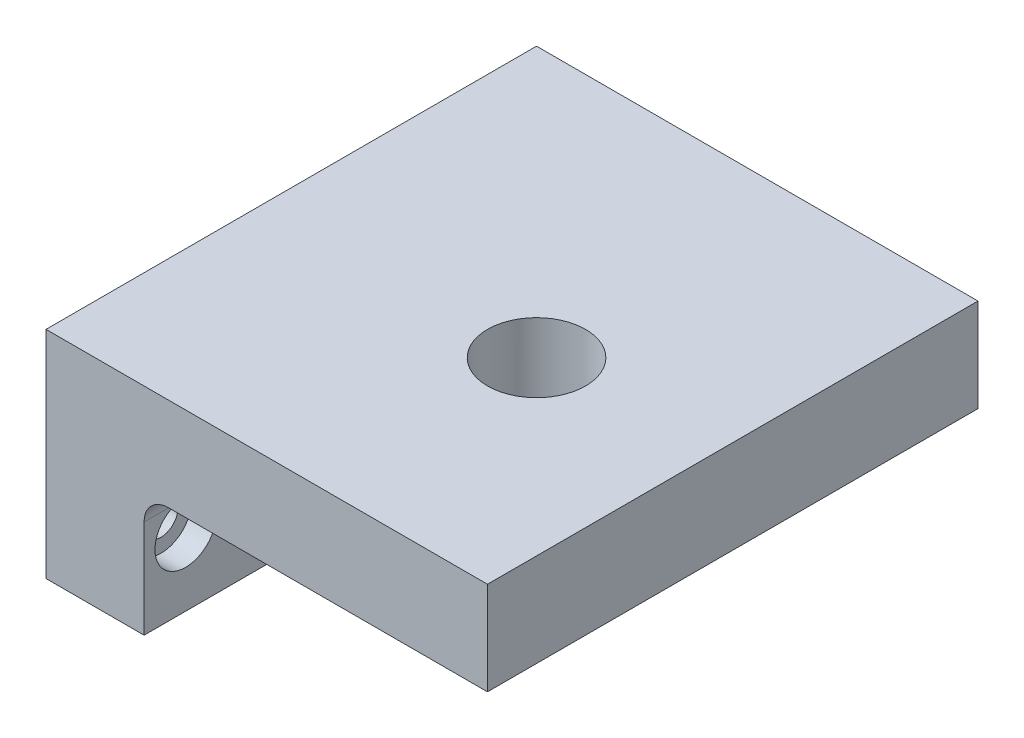
ISO-10303-21;
HEADER;
FILE_DESCRIPTION(('STEP AP214'),'2;1');
FILE_NAME('part.step','',(''),(''),'','','');
FILE_SCHEMA(('AUTOMOTIVE_DESIGN { 1 0 10303 214 1 1 1 1 }'));
ENDSEC;
DATA;
#1=APPLICATION_CONTEXT('core data for automotive mechanical design processes');
#2=APPLICATION_PROTOCOL_DEFINITION('international standard','automotive_design',2000,#1);
#3=PRODUCT_CONTEXT('',#1,'mechanical');
#4=PRODUCT('Part','Part','',(#3));
#5=PRODUCT_RELATED_PRODUCT_CATEGORY('part','',(#4));
#6=PRODUCT_DEFINITION_FORMATION('','',#4);
#7=PRODUCT_DEFINITION_CONTEXT('part definition',#1,'design');
#8=PRODUCT_DEFINITION('design','',#6,#7);
#9=PRODUCT_DEFINITION_SHAPE('','',#8);
#10=(LENGTH_UNIT() NAMED_UNIT(*) SI_UNIT(.MILLI.,.METRE.));
#11=(NAMED_UNIT(*) PLANE_ANGLE_UNIT() SI_UNIT($,.RADIAN.));
#12=(NAMED_UNIT(*) SI_UNIT($,.STERADIAN.) SOLID_ANGLE_UNIT());
#13=UNCERTAINTY_MEASURE_WITH_UNIT(LENGTH_MEASURE(1.E-05),#10,'distance_accuracy_value','');
#14=(GEOMETRIC_REPRESENTATION_CONTEXT(3) GLOBAL_UNCERTAINTY_ASSIGNED_CONTEXT((#13)) GLOBAL_UNIT_ASSIGNED_CONTEXT((#10,
#11,#12)) REPRESENTATION_CONTEXT('',''));
#15=CARTESIAN_POINT('',(0.,0.,0.));
#16=DIRECTION('',(0.,0.,1.));
#17=DIRECTION('',(1.,0.,0.));
#18=AXIS2_PLACEMENT_3D('',#15,#16,#17);
#19=CARTESIAN_POINT('',(45.72,-15.24,46.5));
#20=DIRECTION('',(-1.,0.,0.));
#21=DIRECTION('',(0.,-1.,0.));
#22=AXIS2_PLACEMENT_3D('',#19,#20,#21);
#23=CYLINDRICAL_SURFACE('',#22,1.7399);
#24=CARTESIAN_POINT('',(0.,-15.24,46.5));
#25=DIRECTION('',(-1.,0.,0.));
#26=DIRECTION('',(0.,-1.,0.));
#27=AXIS2_PLACEMENT_3D('',#24,#25,#26);
#28=CIRCLE('',#27,1.7399);
#29=CARTESIAN_POINT('',(0.,-16.9799,46.5));
#30=VERTEX_POINT('',#29);
#31=EDGE_CURVE('E161',#30,#30,#28,.T.);
#32=ORIENTED_EDGE('',*,*,#31,.T.);
#33=EDGE_LOOP('',(#32));
#34=FACE_BOUND('',#33,.T.);
#35=CARTESIAN_POINT('',(7.62,-15.24,46.5));
#36=DIRECTION('',(1.,0.,0.));
#37=DIRECTION('',(0.,1.,0.));
#38=AXIS2_PLACEMENT_3D('',#35,#36,#37);
#39=CIRCLE('',#38,1.7399);
#40=CARTESIAN_POINT('',(7.62,-13.5001,46.5));
#41=VERTEX_POINT('',#40);
#42=EDGE_CURVE('E157',#41,#41,#39,.F.);
#43=ORIENTED_EDGE('',*,*,#42,.F.);
#44=EDGE_LOOP('',(#43));
#45=FACE_BOUND('',#44,.T.);
#46=ADVANCED_FACE('F45',(#34,#45),#23,.F.);
#47=CARTESIAN_POINT('',(0.,0.,50.8));
#48=DIRECTION('',(0.,-1.,0.));
#49=DIRECTION('',(0.,0.,-1.));
#50=AXIS2_PLACEMENT_3D('',#47,#48,#49);
#51=PLANE('',#50);
#52=CARTESIAN_POINT('',(27.94,0.,27.94));
#53=DIRECTION('',(0.,1.,0.));
#54=DIRECTION('',(0.,0.,1.));
#55=AXIS2_PLACEMENT_3D('',#52,#53,#54);
#56=CIRCLE('',#55,5.08000000000001);
#57=CARTESIAN_POINT('',(27.94,0.,33.02));
#58=VERTEX_POINT('',#57);
#59=EDGE_CURVE('E415',#58,#58,#56,.T.);
#60=ORIENTED_EDGE('',*,*,#59,.F.);
#61=EDGE_LOOP('',(#60));
#62=FACE_BOUND('',#61,.T.);
#63=DIRECTION('',(-1.,0.,0.));
#64=VECTOR('',#63,1.);
#65=CARTESIAN_POINT('',(0.,0.,0.));
#66=LINE('',#65,#64);
#67=CARTESIAN_POINT('',(45.72,0.,0.));
#68=VERTEX_POINT('',#67);
#69=CARTESIAN_POINT('',(0.,0.,0.));
#70=VERTEX_POINT('',#69);
#71=EDGE_CURVE('E172',#68,#70,#66,.T.);
#72=ORIENTED_EDGE('',*,*,#71,.T.);
#73=DIRECTION('',(0.,0.,-1.));
#74=VECTOR('',#73,1.);
#75=CARTESIAN_POINT('',(0.,0.,50.8));
#76=LINE('',#75,#74);
#77=CARTESIAN_POINT('',(0.,0.,50.8));
#78=VERTEX_POINT('',#77);
#79=EDGE_CURVE('E229',#78,#70,#76,.T.);
#80=ORIENTED_EDGE('',*,*,#79,.F.);
#81=DIRECTION('',(-1.,0.,0.));
#82=VECTOR('',#81,1.);
#83=CARTESIAN_POINT('',(0.,0.,50.8));
#84=LINE('',#83,#82);
#85=CARTESIAN_POINT('',(45.72,0.,50.8));
#86=VERTEX_POINT('',#85);
#87=EDGE_CURVE('E176',#86,#78,#84,.T.);
#88=ORIENTED_EDGE('',*,*,#87,.F.);
#89=DIRECTION('',(0.,0.,-1.));
#90=VECTOR('',#89,1.);
#91=CARTESIAN_POINT('',(45.72,0.,50.8));
#92=LINE('',#91,#90);
#93=EDGE_CURVE('E197',#86,#68,#92,.T.);
#94=ORIENTED_EDGE('',*,*,#93,.T.);
#95=EDGE_LOOP('',(#72,#80,#88,#94));
#96=FACE_BOUND('',#95,.T.);
#97=ADVANCED_FACE('F260',(#62,#96),#51,.F.);
#98=CARTESIAN_POINT('',(0.,0.,50.8));
#99=DIRECTION('',(1.,0.,0.));
#100=DIRECTION('',(0.,1.,0.));
#101=AXIS2_PLACEMENT_3D('',#98,#99,#100);
#102=PLANE('',#101);
#103=CARTESIAN_POINT('',(0.,-15.24,4.3));
#104=DIRECTION('',(-1.,0.,0.));
#105=DIRECTION('',(0.,-1.,0.));
#106=AXIS2_PLACEMENT_3D('',#103,#104,#105);
#107=CIRCLE('',#106,1.7399);
#108=CARTESIAN_POINT('',(0.,-16.9799,4.3));
#109=VERTEX_POINT('',#108);
#110=EDGE_CURVE('E166',#109,#109,#107,.T.);
#111=ORIENTED_EDGE('',*,*,#110,.F.);
#112=EDGE_LOOP('',(#111));
#113=FACE_BOUND('',#112,.T.);
#114=ORIENTED_EDGE('',*,*,#31,.F.);
#115=EDGE_LOOP('',(#114));
#116=FACE_BOUND('',#115,.T.);
#117=DIRECTION('',(0.,-1.,0.));
#118=VECTOR('',#117,1.);
#119=CARTESIAN_POINT('',(0.,0.,0.));
#120=LINE('',#119,#118);
#121=CARTESIAN_POINT('',(0.,-22.352,0.));
#122=VERTEX_POINT('',#121);
#123=EDGE_CURVE('E201',#70,#122,#120,.T.);
#124=ORIENTED_EDGE('',*,*,#123,.T.);
#125=DIRECTION('',(0.,0.,-1.));
#126=VECTOR('',#125,1.);
#127=CARTESIAN_POINT('',(0.,-22.352,50.8));
#128=LINE('',#127,#126);
#129=CARTESIAN_POINT('',(0.,-22.352,50.8));
#130=VERTEX_POINT('',#129);
#131=EDGE_CURVE('E226',#130,#122,#128,.T.);
#132=ORIENTED_EDGE('',*,*,#131,.F.);
#133=DIRECTION('',(0.,-1.,0.));
#134=VECTOR('',#133,1.);
#135=CARTESIAN_POINT('',(0.,0.,50.8));
#136=LINE('',#135,#134);
#137=EDGE_CURVE('E180',#78,#130,#136,.T.);
#138=ORIENTED_EDGE('',*,*,#137,.F.);
#139=ORIENTED_EDGE('',*,*,#79,.T.);
#140=EDGE_LOOP('',(#124,#132,#138,#139));
#141=FACE_BOUND('',#140,.T.);
#142=ADVANCED_FACE('F255',(#113,#116,#141),#102,.F.);
#143=CARTESIAN_POINT('',(10.16,-22.352,50.8));
#144=DIRECTION('',(0.,1.,0.));
#145=DIRECTION('',(-1.,0.,0.));
#146=AXIS2_PLACEMENT_3D('',#143,#144,#145);
#147=PLANE('',#146);
#148=DIRECTION('',(1.,0.,0.));
#149=VECTOR('',#148,1.);
#150=CARTESIAN_POINT('',(10.16,-22.352,0.));
#151=LINE('',#150,#149);
#152=CARTESIAN_POINT('',(10.16,-22.352,0.));
#153=VERTEX_POINT('',#152);
#154=EDGE_CURVE('E204',#122,#153,#151,.T.);
#155=ORIENTED_EDGE('',*,*,#154,.T.);
#156=DIRECTION('',(0.,0.,-1.));
#157=VECTOR('',#156,1.);
#158=CARTESIAN_POINT('',(10.16,-22.352,50.8));
#159=LINE('',#158,#157);
#160=CARTESIAN_POINT('',(10.16,-22.352,50.8));
#161=VERTEX_POINT('',#160);
#162=EDGE_CURVE('E222',#161,#153,#159,.T.);
#163=ORIENTED_EDGE('',*,*,#162,.F.);
#164=DIRECTION('',(1.,0.,0.));
#165=VECTOR('',#164,1.);
#166=CARTESIAN_POINT('',(10.16,-22.352,50.8));
#167=LINE('',#166,#165);
#168=EDGE_CURVE('E184',#130,#161,#167,.T.);
#169=ORIENTED_EDGE('',*,*,#168,.F.);
#170=ORIENTED_EDGE('',*,*,#131,.T.);
#171=EDGE_LOOP('',(#155,#163,#169,#170));
#172=FACE_BOUND('',#171,.T.);
#173=ADVANCED_FACE('F253',(#172),#147,.F.);
#174=CARTESIAN_POINT('',(10.16,-9.652,50.8));
#175=DIRECTION('',(-1.,0.,0.));
#176=DIRECTION('',(0.,-1.,0.));
#177=AXIS2_PLACEMENT_3D('',#174,#175,#176);
#178=PLANE('',#177);
#179=DIRECTION('',(0.,0.,-1.));
#180=VECTOR('',#179,1.);
#181=CARTESIAN_POINT('',(10.16,-12.192,50.8));
#182=LINE('',#181,#180);
#183=CARTESIAN_POINT('',(10.16,-12.192,5.18900000000001));
#184=VERTEX_POINT('',#183);
#185=CARTESIAN_POINT('',(10.16,-12.192,45.611));
#186=VERTEX_POINT('',#185);
#187=EDGE_CURVE('E125',#184,#186,#182,.F.);
#188=ORIENTED_EDGE('',*,*,#187,.T.);
#189=CARTESIAN_POINT('',(10.16,-15.24,46.5));
#190=DIRECTION('',(1.,0.,0.));
#191=DIRECTION('',(0.,1.,0.));
#192=AXIS2_PLACEMENT_3D('',#189,#190,#191);
#193=CIRCLE('',#192,3.175);
#194=CARTESIAN_POINT('',(10.16,-12.192,47.389));
#195=VERTEX_POINT('',#194);
#196=EDGE_CURVE('E62',#195,#186,#193,.T.);
#197=ORIENTED_EDGE('',*,*,#196,.F.);
#198=CARTESIAN_POINT('',(10.16,-12.192,50.8));
#199=VERTEX_POINT('',#198);
#200=EDGE_CURVE('E146',#195,#199,#182,.F.);
#201=ORIENTED_EDGE('',*,*,#200,.T.);
#202=DIRECTION('',(0.,1.,0.));
#203=VECTOR('',#202,1.);
#204=CARTESIAN_POINT('',(10.16,-9.652,50.8));
#205=LINE('',#204,#203);
#206=EDGE_CURVE('E187',#161,#199,#205,.T.);
#207=ORIENTED_EDGE('',*,*,#206,.F.);
#208=ORIENTED_EDGE('',*,*,#162,.T.);
#209=DIRECTION('',(0.,1.,0.));
#210=VECTOR('',#209,1.);
#211=CARTESIAN_POINT('',(10.16,-9.652,0.));
#212=LINE('',#211,#210);
#213=CARTESIAN_POINT('',(10.16,-12.192,0.));
#214=VERTEX_POINT('',#213);
#215=EDGE_CURVE('E207',#153,#214,#212,.T.);
#216=ORIENTED_EDGE('',*,*,#215,.T.);
#217=CARTESIAN_POINT('',(10.16,-12.192,3.41099999999999));
#218=VERTEX_POINT('',#217);
#219=EDGE_CURVE('E124',#214,#218,#182,.F.);
#220=ORIENTED_EDGE('',*,*,#219,.T.);
#221=CARTESIAN_POINT('',(10.16,-15.24,4.3));
#222=DIRECTION('',(1.,0.,0.));
#223=DIRECTION('',(0.,-1.,0.));
#224=AXIS2_PLACEMENT_3D('',#221,#222,#223);
#225=CIRCLE('',#224,3.175);
#226=EDGE_CURVE('E130',#184,#218,#225,.T.);
#227=ORIENTED_EDGE('',*,*,#226,.F.);
#228=EDGE_LOOP('',(#188,#197,#201,#207,#208,#216,#220,#227));
#229=FACE_BOUND('',#228,.T.);
#230=ADVANCED_FACE('F136',(#229),#178,.F.);
#231=CARTESIAN_POINT('',(45.72,-9.652,50.8));
#232=DIRECTION('',(0.,1.,0.));
#233=DIRECTION('',(-1.,0.,0.));
#234=AXIS2_PLACEMENT_3D('',#231,#232,#233);
#235=PLANE('',#234);
#236=CARTESIAN_POINT('',(27.94,-9.652,27.94));
#237=DIRECTION('',(0.,1.,0.));
#238=DIRECTION('',(-1.,0.,0.));
#239=AXIS2_PLACEMENT_3D('',#236,#237,#238);
#240=CIRCLE('',#239,5.08000000000001);
#241=CARTESIAN_POINT('',(22.86,-9.652,27.94));
#242=VERTEX_POINT('',#241);
#243=EDGE_CURVE('E49',#242,#242,#240,.T.);
#244=ORIENTED_EDGE('',*,*,#243,.T.);
#245=EDGE_LOOP('',(#244));
#246=FACE_BOUND('',#245,.T.);
#247=DIRECTION('',(1.,0.,0.));
#248=VECTOR('',#247,1.);
#249=CARTESIAN_POINT('',(45.72,-9.652,50.8));
#250=LINE('',#249,#248);
#251=CARTESIAN_POINT('',(12.7,-9.652,50.8));
#252=VERTEX_POINT('',#251);
#253=CARTESIAN_POINT('',(45.72,-9.652,50.8));
#254=VERTEX_POINT('',#253);
#255=EDGE_CURVE('E191',#252,#254,#250,.T.);
#256=ORIENTED_EDGE('',*,*,#255,.F.);
#257=DIRECTION('',(0.,0.,-1.));
#258=VECTOR('',#257,1.);
#259=CARTESIAN_POINT('',(12.7,-9.652,0.));
#260=LINE('',#259,#258);
#261=CARTESIAN_POINT('',(12.7,-9.652,0.));
#262=VERTEX_POINT('',#261);
#263=EDGE_CURVE('E150',#252,#262,#260,.T.);
#264=ORIENTED_EDGE('',*,*,#263,.T.);
#265=DIRECTION('',(1.,0.,0.));
#266=VECTOR('',#265,1.);
#267=CARTESIAN_POINT('',(45.72,-9.652,0.));
#268=LINE('',#267,#266);
#269=CARTESIAN_POINT('',(45.72,-9.652,0.));
#270=VERTEX_POINT('',#269);
#271=EDGE_CURVE('E210',#262,#270,#268,.T.);
#272=ORIENTED_EDGE('',*,*,#271,.T.);
#273=DIRECTION('',(0.,0.,-1.));
#274=VECTOR('',#273,1.);
#275=CARTESIAN_POINT('',(45.72,-9.652,50.8));
#276=LINE('',#275,#274);
#277=EDGE_CURVE('E218',#254,#270,#276,.T.);
#278=ORIENTED_EDGE('',*,*,#277,.F.);
#279=EDGE_LOOP('',(#256,#264,#272,#278));
#280=FACE_BOUND('',#279,.T.);
#281=ADVANCED_FACE('F264',(#246,#280),#235,.F.);
#282=CARTESIAN_POINT('',(45.72,0.,50.8));
#283=DIRECTION('',(-1.,0.,0.));
#284=DIRECTION('',(0.,0.,1.));
#285=AXIS2_PLACEMENT_3D('',#282,#283,#284);
#286=PLANE('',#285);
#287=DIRECTION('',(0.,1.,0.));
#288=VECTOR('',#287,1.);
#289=CARTESIAN_POINT('',(45.72,0.,0.));
#290=LINE('',#289,#288);
#291=EDGE_CURVE('E181',#270,#68,#290,.T.);
#292=ORIENTED_EDGE('',*,*,#291,.T.);
#293=ORIENTED_EDGE('',*,*,#93,.F.);
#294=DIRECTION('',(0.,1.,0.));
#295=VECTOR('',#294,1.);
#296=CARTESIAN_POINT('',(45.72,0.,50.8));
#297=LINE('',#296,#295);
#298=EDGE_CURVE('E194',#254,#86,#297,.T.);
#299=ORIENTED_EDGE('',*,*,#298,.F.);
#300=ORIENTED_EDGE('',*,*,#277,.T.);
#301=EDGE_LOOP('',(#292,#293,#299,#300));
#302=FACE_BOUND('',#301,.T.);
#303=ADVANCED_FACE('F262',(#302),#286,.F.);
#304=CARTESIAN_POINT('',(0.,0.,50.8));
#305=DIRECTION('',(0.,0.,-1.));
#306=DIRECTION('',(-1.,0.,0.));
#307=AXIS2_PLACEMENT_3D('',#304,#305,#306);
#308=PLANE('',#307);
#309=ORIENTED_EDGE('',*,*,#87,.T.);
#310=ORIENTED_EDGE('',*,*,#137,.T.);
#311=ORIENTED_EDGE('',*,*,#168,.T.);
#312=ORIENTED_EDGE('',*,*,#206,.T.);
#313=CARTESIAN_POINT('',(12.7,-12.192,50.8));
#314=DIRECTION('',(0.,0.,-1.));
#315=DIRECTION('',(-1.,0.,0.));
#316=AXIS2_PLACEMENT_3D('',#313,#314,#315);
#317=CIRCLE('',#316,2.54);
#318=EDGE_CURVE('E11',#199,#252,#317,.T.);
#319=ORIENTED_EDGE('',*,*,#318,.T.);
#320=ORIENTED_EDGE('',*,*,#255,.T.);
#321=ORIENTED_EDGE('',*,*,#298,.T.);
#322=EDGE_LOOP('',(#309,#310,#311,#312,#319,#320,#321));
#323=FACE_BOUND('',#322,.T.);
#324=ADVANCED_FACE('F243',(#323),#308,.F.);
#325=CARTESIAN_POINT('',(0.,0.,0.));
#326=DIRECTION('',(0.,0.,-1.));
#327=DIRECTION('',(-1.,0.,0.));
#328=AXIS2_PLACEMENT_3D('',#325,#326,#327);
#329=PLANE('',#328);
#330=ORIENTED_EDGE('',*,*,#71,.F.);
#331=ORIENTED_EDGE('',*,*,#291,.F.);
#332=ORIENTED_EDGE('',*,*,#271,.F.);
#333=CARTESIAN_POINT('',(12.7,-12.192,0.));
#334=DIRECTION('',(0.,0.,-1.));
#335=DIRECTION('',(-1.,0.,0.));
#336=AXIS2_PLACEMENT_3D('',#333,#334,#335);
#337=CIRCLE('',#336,2.54);
#338=EDGE_CURVE('E55',#262,#214,#337,.F.);
#339=ORIENTED_EDGE('',*,*,#338,.T.);
#340=ORIENTED_EDGE('',*,*,#215,.F.);
#341=ORIENTED_EDGE('',*,*,#154,.F.);
#342=ORIENTED_EDGE('',*,*,#123,.F.);
#343=EDGE_LOOP('',(#330,#331,#332,#339,#340,#341,#342));
#344=FACE_BOUND('',#343,.T.);
#345=ADVANCED_FACE('F249',(#344),#329,.T.);
#346=CARTESIAN_POINT('',(45.72,-15.24,4.3));
#347=DIRECTION('',(-1.,0.,0.));
#348=DIRECTION('',(0.,-1.,0.));
#349=AXIS2_PLACEMENT_3D('',#346,#347,#348);
#350=CYLINDRICAL_SURFACE('',#349,1.7399);
#351=CARTESIAN_POINT('',(7.62,-15.24,4.3));
#352=DIRECTION('',(-1.,0.,0.));
#353=DIRECTION('',(0.,-1.,0.));
#354=AXIS2_PLACEMENT_3D('',#351,#352,#353);
#355=CIRCLE('',#354,1.7399);
#356=CARTESIAN_POINT('',(7.62,-16.9799,4.3));
#357=VERTEX_POINT('',#356);
#358=EDGE_CURVE('E154',#357,#357,#355,.F.);
#359=ORIENTED_EDGE('',*,*,#358,.T.);
#360=EDGE_LOOP('',(#359));
#361=FACE_BOUND('',#360,.T.);
#362=ORIENTED_EDGE('',*,*,#110,.T.);
#363=EDGE_LOOP('',(#362));
#364=FACE_BOUND('',#363,.T.);
#365=ADVANCED_FACE('F286',(#361,#364),#350,.F.);
#366=CARTESIAN_POINT('',(12.7,-12.192,50.8));
#367=DIRECTION('',(0.,0.,1.));
#368=DIRECTION('',(1.,0.,0.));
#369=AXIS2_PLACEMENT_3D('',#366,#367,#368);
#370=CYLINDRICAL_SURFACE('',#369,2.54);
#371=ORIENTED_EDGE('',*,*,#318,.F.);
#372=ORIENTED_EDGE('',*,*,#200,.F.);
#373=EDGE_CURVE('E143',#186,#195,#182,.F.);
#374=ORIENTED_EDGE('',*,*,#373,.F.);
#375=ORIENTED_EDGE('',*,*,#187,.F.);
#376=EDGE_CURVE('E117',#218,#184,#182,.F.);
#377=ORIENTED_EDGE('',*,*,#376,.F.);
#378=ORIENTED_EDGE('',*,*,#219,.F.);
#379=ORIENTED_EDGE('',*,*,#338,.F.);
#380=ORIENTED_EDGE('',*,*,#263,.F.);
#381=EDGE_LOOP('',(#371,#372,#374,#375,#377,#378,#379,#380));
#382=FACE_BOUND('',#381,.T.);
#383=ADVANCED_FACE('F47',(#382),#370,.F.);
#384=CARTESIAN_POINT('',(7.62,-15.24,4.3));
#385=DIRECTION('',(-1.,0.,0.));
#386=DIRECTION('',(0.,-1.,0.));
#387=AXIS2_PLACEMENT_3D('',#384,#385,#386);
#388=PLANE('',#387);
#389=CARTESIAN_POINT('',(7.62,-15.24,4.3));
#390=DIRECTION('',(1.,0.,0.));
#391=DIRECTION('',(0.,-1.,0.));
#392=AXIS2_PLACEMENT_3D('',#389,#390,#391);
#393=CIRCLE('',#392,3.175);
#394=CARTESIAN_POINT('',(7.62,-18.415,4.3));
#395=VERTEX_POINT('',#394);
#396=EDGE_CURVE('E139',#395,#395,#393,.T.);
#397=ORIENTED_EDGE('',*,*,#396,.T.);
#398=EDGE_LOOP('',(#397));
#399=FACE_BOUND('',#398,.T.);
#400=ORIENTED_EDGE('',*,*,#358,.F.);
#401=EDGE_LOOP('',(#400));
#402=FACE_BOUND('',#401,.T.);
#403=ADVANCED_FACE('F297',(#399,#402),#388,.F.);
#404=CARTESIAN_POINT('',(7.62,-15.24,4.3));
#405=DIRECTION('',(1.,0.,0.));
#406=DIRECTION('',(0.,1.,0.));
#407=AXIS2_PLACEMENT_3D('',#404,#405,#406);
#408=CYLINDRICAL_SURFACE('',#407,3.175);
#409=ORIENTED_EDGE('',*,*,#396,.F.);
#410=EDGE_LOOP('',(#409));
#411=FACE_BOUND('',#410,.T.);
#412=EDGE_CURVE('E69',#218,#184,#225,.T.);
#413=ORIENTED_EDGE('',*,*,#412,.T.);
#414=ORIENTED_EDGE('',*,*,#226,.T.);
#415=EDGE_LOOP('',(#413,#414));
#416=FACE_BOUND('',#415,.T.);
#417=ADVANCED_FACE('F129',(#411,#416),#408,.F.);
#418=CARTESIAN_POINT('',(10.16,-15.24,4.3));
#419=DIRECTION('',(-1.,0.,0.));
#420=DIRECTION('',(0.,-1.,0.));
#421=AXIS2_PLACEMENT_3D('',#418,#419,#420);
#422=PLANE('',#421);
#423=ORIENTED_EDGE('',*,*,#412,.F.);
#424=ORIENTED_EDGE('',*,*,#376,.T.);
#425=EDGE_LOOP('',(#423,#424));
#426=FACE_BOUND('',#425,.T.);
#427=ADVANCED_FACE('F118',(#426),#422,.T.);
#428=CARTESIAN_POINT('',(7.62,-15.24,46.5));
#429=DIRECTION('',(1.,0.,0.));
#430=DIRECTION('',(0.,1.,0.));
#431=AXIS2_PLACEMENT_3D('',#428,#429,#430);
#432=PLANE('',#431);
#433=CARTESIAN_POINT('',(7.62,-15.24,46.5));
#434=DIRECTION('',(1.,0.,0.));
#435=DIRECTION('',(0.,1.,0.));
#436=AXIS2_PLACEMENT_3D('',#433,#434,#435);
#437=CIRCLE('',#436,3.175);
#438=CARTESIAN_POINT('',(7.62,-12.065,46.5));
#439=VERTEX_POINT('',#438);
#440=EDGE_CURVE('E158',#439,#439,#437,.T.);
#441=ORIENTED_EDGE('',*,*,#440,.T.);
#442=EDGE_LOOP('',(#441));
#443=FACE_BOUND('',#442,.T.);
#444=ORIENTED_EDGE('',*,*,#42,.T.);
#445=EDGE_LOOP('',(#444));
#446=FACE_BOUND('',#445,.T.);
#447=ADVANCED_FACE('F371',(#443,#446),#432,.T.);
#448=CARTESIAN_POINT('',(10.16,-15.24,46.5));
#449=DIRECTION('',(1.,0.,0.));
#450=DIRECTION('',(0.,1.,0.));
#451=AXIS2_PLACEMENT_3D('',#448,#449,#450);
#452=PLANE('',#451);
#453=EDGE_CURVE('E132',#186,#195,#193,.T.);
#454=ORIENTED_EDGE('',*,*,#453,.F.);
#455=ORIENTED_EDGE('',*,*,#373,.T.);
#456=EDGE_LOOP('',(#454,#455));
#457=FACE_BOUND('',#456,.T.);
#458=ADVANCED_FACE('F380',(#457),#452,.F.);
#459=CARTESIAN_POINT('',(7.62,-15.24,46.5));
#460=DIRECTION('',(1.,0.,0.));
#461=DIRECTION('',(0.,1.,0.));
#462=AXIS2_PLACEMENT_3D('',#459,#460,#461);
#463=CYLINDRICAL_SURFACE('',#462,3.175);
#464=ORIENTED_EDGE('',*,*,#440,.F.);
#465=EDGE_LOOP('',(#464));
#466=FACE_BOUND('',#465,.T.);
#467=ORIENTED_EDGE('',*,*,#196,.T.);
#468=ORIENTED_EDGE('',*,*,#453,.T.);
#469=EDGE_LOOP('',(#467,#468));
#470=FACE_BOUND('',#469,.T.);
#471=ADVANCED_FACE('F390',(#466,#470),#463,.F.);
#472=CARTESIAN_POINT('',(27.94,-22.352,27.94));
#473=DIRECTION('',(0.,1.,0.));
#474=DIRECTION('',(0.,0.,1.));
#475=AXIS2_PLACEMENT_3D('',#472,#473,#474);
#476=CYLINDRICAL_SURFACE('',#475,5.08000000000001);
#477=ORIENTED_EDGE('',*,*,#59,.T.);
#478=EDGE_LOOP('',(#477));
#479=FACE_BOUND('',#478,.T.);
#480=ORIENTED_EDGE('',*,*,#243,.F.);
#481=EDGE_LOOP('',(#480));
#482=FACE_BOUND('',#481,.T.);
#483=ADVANCED_FACE('F400',(#479,#482),#476,.F.);
#484=CLOSED_SHELL('',(#46,#97,#142,#173,#230,#281,#303,#324,#345,#365,#383,#403,#417,#427,#447,
#458,#471,#483));
#485=MANIFOLD_SOLID_BREP('B2',#484);
#486=ADVANCED_BREP_SHAPE_REPRESENTATION('',(#18,#485),#14);
#487=SHAPE_DEFINITION_REPRESENTATION(#9,#486);
ENDSEC;
END-ISO-10303-21;
